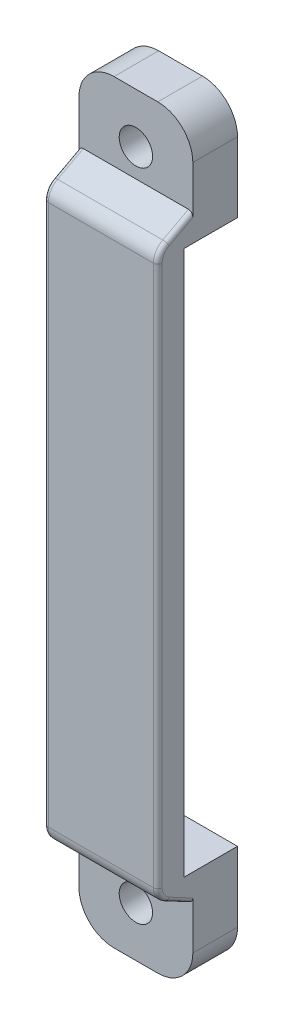
ISO-10303-21;
HEADER;
FILE_DESCRIPTION(('STEP AP214'),'2;1');
FILE_NAME('part.step','',(''),(''),'','','');
FILE_SCHEMA(('AUTOMOTIVE_DESIGN { 1 0 10303 214 1 1 1 1 }'));
ENDSEC;
DATA;
#1=APPLICATION_CONTEXT('core data for automotive mechanical design processes');
#2=APPLICATION_PROTOCOL_DEFINITION('international standard','automotive_design',2000,#1);
#3=PRODUCT_CONTEXT('',#1,'mechanical');
#4=PRODUCT('Part','Part','',(#3));
#5=PRODUCT_RELATED_PRODUCT_CATEGORY('part','',(#4));
#6=PRODUCT_DEFINITION_FORMATION('','',#4);
#7=PRODUCT_DEFINITION_CONTEXT('part definition',#1,'design');
#8=PRODUCT_DEFINITION('design','',#6,#7);
#9=PRODUCT_DEFINITION_SHAPE('','',#8);
#10=(LENGTH_UNIT() NAMED_UNIT(*) SI_UNIT(.MILLI.,.METRE.));
#11=(NAMED_UNIT(*) PLANE_ANGLE_UNIT() SI_UNIT($,.RADIAN.));
#12=(NAMED_UNIT(*) SI_UNIT($,.STERADIAN.) SOLID_ANGLE_UNIT());
#13=UNCERTAINTY_MEASURE_WITH_UNIT(LENGTH_MEASURE(1.E-05),#10,'distance_accuracy_value','');
#14=(GEOMETRIC_REPRESENTATION_CONTEXT(3) GLOBAL_UNCERTAINTY_ASSIGNED_CONTEXT((#13)) GLOBAL_UNIT_ASSIGNED_CONTEXT((#10,
#11,#12)) REPRESENTATION_CONTEXT('',''));
#15=CARTESIAN_POINT('',(0.,0.,0.));
#16=DIRECTION('',(0.,0.,1.));
#17=DIRECTION('',(1.,0.,0.));
#18=AXIS2_PLACEMENT_3D('',#15,#16,#17);
#19=CARTESIAN_POINT('',(-5.69720062871215,0.,3.));
#20=DIRECTION('',(1.,0.,0.));
#21=DIRECTION('',(0.,1.,0.));
#22=AXIS2_PLACEMENT_3D('',#19,#20,#21);
#23=PLANE('',#22);
#24=CARTESIAN_POINT('',(-5.69720062871216,56.2893408128409,1.));
#25=DIRECTION('',(1.,0.,0.));
#26=DIRECTION('',(0.,1.,0.));
#27=AXIS2_PLACEMENT_3D('',#24,#25,#26);
#28=CIRCLE('',#27,1.5);
#29=CARTESIAN_POINT('',(-5.69720062871216,57.6137622021293,1.70420734417884));
#30=VERTEX_POINT('',#29);
#31=CARTESIAN_POINT('',(-5.69720062871216,56.2893408128409,2.5));
#32=VERTEX_POINT('',#31);
#33=EDGE_CURVE('E361',#30,#32,#28,.T.);
#34=ORIENTED_EDGE('',*,*,#33,.F.);
#35=DIRECTION('',(0.,0.469471562785896,-0.882947592858924));
#36=VECTOR('',#35,1.);
#37=CARTESIAN_POINT('',(-5.69720062871216,44.378354184947,26.5963894817503));
#38=LINE('',#37,#36);
#39=CARTESIAN_POINT('',(-5.69720062871216,59.0516147521974,-1.));
#40=VERTEX_POINT('',#39);
#41=EDGE_CURVE('E323',#30,#40,#38,.T.);
#42=ORIENTED_EDGE('',*,*,#41,.T.);
#43=DIRECTION('',(0.,-1.,0.));
#44=VECTOR('',#43,1.);
#45=CARTESIAN_POINT('',(-5.69720062871215,0.,-1.));
#46=LINE('',#45,#44);
#47=CARTESIAN_POINT('',(-5.69720062871216,64.4910620508948,-1.));
#48=VERTEX_POINT('',#47);
#49=EDGE_CURVE('E463',#48,#40,#46,.T.);
#50=ORIENTED_EDGE('',*,*,#49,.F.);
#51=DIRECTION('',(0.,0.,-1.));
#52=VECTOR('',#51,1.);
#53=CARTESIAN_POINT('',(-5.69720062871216,64.4910620508948,-6.1));
#54=LINE('',#53,#52);
#55=CARTESIAN_POINT('',(-5.69720062871216,64.4910620508948,-6.1));
#56=VERTEX_POINT('',#55);
#57=EDGE_CURVE('E235',#48,#56,#54,.T.);
#58=ORIENTED_EDGE('',*,*,#57,.T.);
#59=DIRECTION('',(0.,1.,0.));
#60=VECTOR('',#59,1.);
#61=CARTESIAN_POINT('',(-5.69720062871215,0.,-6.1));
#62=LINE('',#61,#60);
#63=CARTESIAN_POINT('',(-5.69720062871216,56.4910620508953,-6.1));
#64=VERTEX_POINT('',#63);
#65=EDGE_CURVE('E216',#64,#56,#62,.T.);
#66=ORIENTED_EDGE('',*,*,#65,.F.);
#67=DIRECTION('',(0.,0.,1.));
#68=VECTOR('',#67,1.);
#69=CARTESIAN_POINT('',(-5.69720062871216,56.4910620508953,-6.1));
#70=LINE('',#69,#68);
#71=CARTESIAN_POINT('',(-5.69720062871216,56.4910620508953,0.));
#72=VERTEX_POINT('',#71);
#73=EDGE_CURVE('E225',#64,#72,#70,.T.);
#74=ORIENTED_EDGE('',*,*,#73,.T.);
#75=DIRECTION('',(0.,-1.,0.));
#76=VECTOR('',#75,1.);
#77=CARTESIAN_POINT('',(-5.69720062871215,0.,0.));
#78=LINE('',#77,#76);
#79=CARTESIAN_POINT('',(-5.69720062871215,-5.65893794910528,0.));
#80=VERTEX_POINT('',#79);
#81=EDGE_CURVE('E267',#72,#80,#78,.T.);
#82=ORIENTED_EDGE('',*,*,#81,.T.);
#83=DIRECTION('',(0.,0.,1.));
#84=VECTOR('',#83,1.);
#85=CARTESIAN_POINT('',(-5.69720062871215,-5.65893794910528,-6.1));
#86=LINE('',#85,#84);
#87=CARTESIAN_POINT('',(-5.69720062871215,-5.65893794910528,-6.1));
#88=VERTEX_POINT('',#87);
#89=EDGE_CURVE('E259',#88,#80,#86,.T.);
#90=ORIENTED_EDGE('',*,*,#89,.F.);
#91=DIRECTION('',(0.,1.,0.));
#92=VECTOR('',#91,1.);
#93=CARTESIAN_POINT('',(-5.69720062871215,0.,-6.1));
#94=LINE('',#93,#92);
#95=CARTESIAN_POINT('',(-5.69720062871215,-13.6589379491052,-6.1));
#96=VERTEX_POINT('',#95);
#97=EDGE_CURVE('E254',#96,#88,#94,.T.);
#98=ORIENTED_EDGE('',*,*,#97,.F.);
#99=DIRECTION('',(0.,0.,-1.));
#100=VECTOR('',#99,1.);
#101=CARTESIAN_POINT('',(-5.69720062871215,-13.6589379491052,3.));
#102=LINE('',#101,#100);
#103=CARTESIAN_POINT('',(-5.69720062871215,-13.6589379491052,-1.));
#104=VERTEX_POINT('',#103);
#105=EDGE_CURVE('E296',#96,#104,#102,.F.);
#106=ORIENTED_EDGE('',*,*,#105,.T.);
#107=DIRECTION('',(0.,-1.,0.));
#108=VECTOR('',#107,1.);
#109=CARTESIAN_POINT('',(-5.69720062871215,0.,-1.));
#110=LINE('',#109,#108);
#111=CARTESIAN_POINT('',(-5.69720062871215,-8.21949065040744,-1.));
#112=VERTEX_POINT('',#111);
#113=EDGE_CURVE('E387',#112,#104,#110,.T.);
#114=ORIENTED_EDGE('',*,*,#113,.F.);
#115=DIRECTION('',(0.,-0.469471562785896,-0.882947592858924));
#116=VECTOR('',#115,1.);
#117=CARTESIAN_POINT('',(-5.69720062871215,-4.74981060101959,5.52551909516782));
#118=LINE('',#117,#116);
#119=CARTESIAN_POINT('',(-5.69720062871215,-6.78163810033929,1.70420734417884));
#120=VERTEX_POINT('',#119);
#121=EDGE_CURVE('E317',#112,#120,#118,.F.);
#122=ORIENTED_EDGE('',*,*,#121,.T.);
#123=CARTESIAN_POINT('',(-5.69720062871215,-5.45721671105091,1.));
#124=DIRECTION('',(1.,0.,0.));
#125=DIRECTION('',(0.,1.,0.));
#126=AXIS2_PLACEMENT_3D('',#123,#124,#125);
#127=CIRCLE('',#126,1.5);
#128=CARTESIAN_POINT('',(-5.69720062871215,-5.45721671105091,2.5));
#129=VERTEX_POINT('',#128);
#130=EDGE_CURVE('E358',#129,#120,#127,.T.);
#131=ORIENTED_EDGE('',*,*,#130,.F.);
#132=DIRECTION('',(0.,-1.,0.));
#133=VECTOR('',#132,1.);
#134=CARTESIAN_POINT('',(-5.69720062871216,57.491062050896,2.5));
#135=LINE('',#134,#133);
#136=EDGE_CURVE('E320',#129,#32,#135,.F.);
#137=ORIENTED_EDGE('',*,*,#136,.T.);
#138=EDGE_LOOP('',(#34,#42,#50,#58,#66,#74,#82,#90,#98,#106,#114,#122,#131,#137));
#139=FACE_BOUND('',#138,.T.);
#140=ADVANCED_FACE('F45',(#139),#23,.F.);
#141=CARTESIAN_POINT('',(7.30279937128784,0.,3.));
#142=DIRECTION('',(1.,0.,0.));
#143=DIRECTION('',(0.,1.,0.));
#144=AXIS2_PLACEMENT_3D('',#141,#142,#143);
#145=PLANE('',#144);
#146=CARTESIAN_POINT('',(7.30279937128783,56.2893408128409,1.));
#147=DIRECTION('',(1.,0.,0.));
#148=DIRECTION('',(0.,1.,0.));
#149=AXIS2_PLACEMENT_3D('',#146,#147,#148);
#150=CIRCLE('',#149,1.5);
#151=CARTESIAN_POINT('',(7.30279937128783,56.2893408128409,2.5));
#152=VERTEX_POINT('',#151);
#153=CARTESIAN_POINT('',(7.30279937128783,57.6137622021293,1.70420734417884));
#154=VERTEX_POINT('',#153);
#155=EDGE_CURVE('E356',#152,#154,#150,.F.);
#156=ORIENTED_EDGE('',*,*,#155,.F.);
#157=DIRECTION('',(0.,-1.,0.));
#158=VECTOR('',#157,1.);
#159=CARTESIAN_POINT('',(7.30279937128784,0.,2.5));
#160=LINE('',#159,#158);
#161=CARTESIAN_POINT('',(7.30279937128784,-5.45721671105091,2.5));
#162=VERTEX_POINT('',#161);
#163=EDGE_CURVE('E325',#152,#162,#160,.T.);
#164=ORIENTED_EDGE('',*,*,#163,.T.);
#165=CARTESIAN_POINT('',(7.30279937128784,-5.45721671105091,1.));
#166=DIRECTION('',(1.,0.,0.));
#167=DIRECTION('',(0.,1.,0.));
#168=AXIS2_PLACEMENT_3D('',#165,#166,#167);
#169=CIRCLE('',#168,1.5);
#170=CARTESIAN_POINT('',(7.30279937128784,-6.78163810033929,1.70420734417884));
#171=VERTEX_POINT('',#170);
#172=EDGE_CURVE('E354',#171,#162,#169,.F.);
#173=ORIENTED_EDGE('',*,*,#172,.F.);
#174=DIRECTION('',(0.,0.469471562785896,0.882947592858924));
#175=VECTOR('',#174,1.);
#176=CARTESIAN_POINT('',(7.30279937128784,-8.3443018793225,-1.23473578139295));
#177=LINE('',#176,#175);
#178=CARTESIAN_POINT('',(7.30279937128784,-8.21949065040744,-1.));
#179=VERTEX_POINT('',#178);
#180=EDGE_CURVE('E331',#171,#179,#177,.F.);
#181=ORIENTED_EDGE('',*,*,#180,.T.);
#182=DIRECTION('',(0.,1.,0.));
#183=VECTOR('',#182,1.);
#184=CARTESIAN_POINT('',(7.30279937128784,0.,-1.));
#185=LINE('',#184,#183);
#186=CARTESIAN_POINT('',(7.30279937128784,-13.6589379491052,-1.));
#187=VERTEX_POINT('',#186);
#188=EDGE_CURVE('E541',#187,#179,#185,.T.);
#189=ORIENTED_EDGE('',*,*,#188,.F.);
#190=DIRECTION('',(0.,0.,-1.));
#191=VECTOR('',#190,1.);
#192=CARTESIAN_POINT('',(7.30279937128784,-13.6589379491052,-6.1));
#193=LINE('',#192,#191);
#194=CARTESIAN_POINT('',(7.30279937128784,-13.6589379491052,-6.1));
#195=VERTEX_POINT('',#194);
#196=EDGE_CURVE('E279',#187,#195,#193,.T.);
#197=ORIENTED_EDGE('',*,*,#196,.T.);
#198=DIRECTION('',(0.,-1.,0.));
#199=VECTOR('',#198,1.);
#200=CARTESIAN_POINT('',(7.30279937128784,0.,-6.1));
#201=LINE('',#200,#199);
#202=CARTESIAN_POINT('',(7.30279937128784,-5.65893794910528,-6.1));
#203=VERTEX_POINT('',#202);
#204=EDGE_CURVE('E247',#203,#195,#201,.T.);
#205=ORIENTED_EDGE('',*,*,#204,.F.);
#206=DIRECTION('',(0.,0.,1.));
#207=VECTOR('',#206,1.);
#208=CARTESIAN_POINT('',(7.30279937128784,-5.65893794910528,-6.1));
#209=LINE('',#208,#207);
#210=CARTESIAN_POINT('',(7.30279937128784,-5.65893794910528,0.));
#211=VERTEX_POINT('',#210);
#212=EDGE_CURVE('E264',#203,#211,#209,.T.);
#213=ORIENTED_EDGE('',*,*,#212,.T.);
#214=DIRECTION('',(0.,-1.,0.));
#215=VECTOR('',#214,1.);
#216=CARTESIAN_POINT('',(7.30279937128784,0.,0.));
#217=LINE('',#216,#215);
#218=CARTESIAN_POINT('',(7.30279937128783,56.4910620508953,0.));
#219=VERTEX_POINT('',#218);
#220=EDGE_CURVE('E269',#219,#211,#217,.T.);
#221=ORIENTED_EDGE('',*,*,#220,.F.);
#222=DIRECTION('',(0.,0.,1.));
#223=VECTOR('',#222,1.);
#224=CARTESIAN_POINT('',(7.30279937128783,56.4910620508953,-6.1));
#225=LINE('',#224,#223);
#226=CARTESIAN_POINT('',(7.30279937128783,56.4910620508953,-6.1));
#227=VERTEX_POINT('',#226);
#228=EDGE_CURVE('E230',#227,#219,#225,.T.);
#229=ORIENTED_EDGE('',*,*,#228,.F.);
#230=DIRECTION('',(0.,-1.,0.));
#231=VECTOR('',#230,1.);
#232=CARTESIAN_POINT('',(7.30279937128784,0.,-6.1));
#233=LINE('',#232,#231);
#234=CARTESIAN_POINT('',(7.30279937128783,64.4910620508948,-6.1));
#235=VERTEX_POINT('',#234);
#236=EDGE_CURVE('E218',#235,#227,#233,.T.);
#237=ORIENTED_EDGE('',*,*,#236,.F.);
#238=DIRECTION('',(0.,0.,-1.));
#239=VECTOR('',#238,1.);
#240=CARTESIAN_POINT('',(7.30279937128783,64.4910620508948,3.));
#241=LINE('',#240,#239);
#242=CARTESIAN_POINT('',(7.30279937128783,64.4910620508948,-1.));
#243=VERTEX_POINT('',#242);
#244=EDGE_CURVE('E277',#235,#243,#241,.F.);
#245=ORIENTED_EDGE('',*,*,#244,.T.);
#246=DIRECTION('',(0.,1.,0.));
#247=VECTOR('',#246,1.);
#248=CARTESIAN_POINT('',(7.30279937128784,0.,-1.));
#249=LINE('',#248,#247);
#250=CARTESIAN_POINT('',(7.30279937128783,59.0516147521974,-1.));
#251=VERTEX_POINT('',#250);
#252=EDGE_CURVE('E538',#251,#243,#249,.T.);
#253=ORIENTED_EDGE('',*,*,#252,.F.);
#254=DIRECTION('',(0.,-0.469471562785896,0.882947592858924));
#255=VECTOR('',#254,1.);
#256=CARTESIAN_POINT('',(7.30279937128783,57.0495882544665,2.76526421860705));
#257=LINE('',#256,#255);
#258=EDGE_CURVE('E328',#251,#154,#257,.T.);
#259=ORIENTED_EDGE('',*,*,#258,.T.);
#260=EDGE_LOOP('',(#156,#164,#173,#181,#189,#197,#205,#213,#221,#229,#237,#245,#253,#259));
#261=FACE_BOUND('',#260,.T.);
#262=ADVANCED_FACE('F432',(#261),#145,.T.);
#263=CARTESIAN_POINT('',(0.,0.,3.));
#264=DIRECTION('',(0.,0.,1.));
#265=DIRECTION('',(1.,0.,0.));
#266=AXIS2_PLACEMENT_3D('',#263,#264,#265);
#267=PLANE('',#266);
#268=DIRECTION('',(0.,-1.,0.));
#269=VECTOR('',#268,1.);
#270=CARTESIAN_POINT('',(-5.19720062871215,-6.65893794910603,3.));
#271=LINE('',#270,#269);
#272=CARTESIAN_POINT('',(-5.19720062871216,56.2893408128409,3.));
#273=VERTEX_POINT('',#272);
#274=CARTESIAN_POINT('',(-5.19720062871215,-5.45721671105091,3.));
#275=VERTEX_POINT('',#274);
#276=EDGE_CURVE('E314',#273,#275,#271,.T.);
#277=ORIENTED_EDGE('',*,*,#276,.T.);
#278=DIRECTION('',(-1.,0.,0.));
#279=VECTOR('',#278,1.);
#280=CARTESIAN_POINT('',(6.80279937128784,-5.45721671105091,3.));
#281=LINE('',#280,#279);
#282=CARTESIAN_POINT('',(6.80279937128784,-5.45721671105091,3.));
#283=VERTEX_POINT('',#282);
#284=EDGE_CURVE('E379',#275,#283,#281,.F.);
#285=ORIENTED_EDGE('',*,*,#284,.T.);
#286=DIRECTION('',(0.,-1.,0.));
#287=VECTOR('',#286,1.);
#288=CARTESIAN_POINT('',(6.80279937128784,0.,3.));
#289=LINE('',#288,#287);
#290=CARTESIAN_POINT('',(6.80279937128783,56.2893408128409,3.));
#291=VERTEX_POINT('',#290);
#292=EDGE_CURVE('E311',#283,#291,#289,.F.);
#293=ORIENTED_EDGE('',*,*,#292,.T.);
#294=DIRECTION('',(1.,0.,0.));
#295=VECTOR('',#294,1.);
#296=CARTESIAN_POINT('',(-5.19720062871216,56.2893408128409,3.));
#297=LINE('',#296,#295);
#298=EDGE_CURVE('E377',#291,#273,#297,.F.);
#299=ORIENTED_EDGE('',*,*,#298,.T.);
#300=EDGE_LOOP('',(#277,#285,#293,#299));
#301=FACE_BOUND('',#300,.T.);
#302=ADVANCED_FACE('F451',(#301),#267,.T.);
#303=CARTESIAN_POINT('',(0.,-17.6589379491052,3.));
#304=DIRECTION('',(0.,1.,0.));
#305=DIRECTION('',(0.,0.,1.));
#306=AXIS2_PLACEMENT_3D('',#303,#304,#305);
#307=PLANE('',#306);
#308=DIRECTION('',(-1.,0.,0.));
#309=VECTOR('',#308,1.);
#310=CARTESIAN_POINT('',(0.,-17.6589379491052,-6.1));
#311=LINE('',#310,#309);
#312=CARTESIAN_POINT('',(3.30279937128784,-17.6589379491052,-6.1));
#313=VERTEX_POINT('',#312);
#314=CARTESIAN_POINT('',(-1.69720062871215,-17.6589379491052,-6.1));
#315=VERTEX_POINT('',#314);
#316=EDGE_CURVE('E251',#313,#315,#311,.T.);
#317=ORIENTED_EDGE('',*,*,#316,.F.);
#318=DIRECTION('',(0.,0.,-1.));
#319=VECTOR('',#318,1.);
#320=CARTESIAN_POINT('',(3.30279937128784,-17.6589379491052,-1.));
#321=LINE('',#320,#319);
#322=CARTESIAN_POINT('',(3.30279937128784,-17.6589379491052,-1.));
#323=VERTEX_POINT('',#322);
#324=EDGE_CURVE('E289',#313,#323,#321,.F.);
#325=ORIENTED_EDGE('',*,*,#324,.T.);
#326=DIRECTION('',(1.,0.,0.));
#327=VECTOR('',#326,1.);
#328=CARTESIAN_POINT('',(0.,-17.6589379491052,-1.));
#329=LINE('',#328,#327);
#330=CARTESIAN_POINT('',(-1.69720062871215,-17.6589379491052,-1.));
#331=VERTEX_POINT('',#330);
#332=EDGE_CURVE('E413',#331,#323,#329,.T.);
#333=ORIENTED_EDGE('',*,*,#332,.F.);
#334=DIRECTION('',(0.,0.,-1.));
#335=VECTOR('',#334,1.);
#336=CARTESIAN_POINT('',(-1.69720062871215,-17.6589379491052,3.));
#337=LINE('',#336,#335);
#338=EDGE_CURVE('E286',#331,#315,#337,.T.);
#339=ORIENTED_EDGE('',*,*,#338,.T.);
#340=EDGE_LOOP('',(#317,#325,#333,#339));
#341=FACE_BOUND('',#340,.T.);
#342=ADVANCED_FACE('F486',(#341),#307,.F.);
#343=CARTESIAN_POINT('',(0.,68.4910620508948,3.));
#344=DIRECTION('',(0.,1.,0.));
#345=DIRECTION('',(0.,0.,1.));
#346=AXIS2_PLACEMENT_3D('',#343,#344,#345);
#347=PLANE('',#346);
#348=DIRECTION('',(-1.,0.,0.));
#349=VECTOR('',#348,1.);
#350=CARTESIAN_POINT('',(0.,68.4910620508948,-1.));
#351=LINE('',#350,#349);
#352=CARTESIAN_POINT('',(3.30279937128783,68.4910620508948,-1.));
#353=VERTEX_POINT('',#352);
#354=CARTESIAN_POINT('',(-1.69720062871216,68.4910620508948,-1.));
#355=VERTEX_POINT('',#354);
#356=EDGE_CURVE('E545',#353,#355,#351,.T.);
#357=ORIENTED_EDGE('',*,*,#356,.F.);
#358=DIRECTION('',(0.,0.,-1.));
#359=VECTOR('',#358,1.);
#360=CARTESIAN_POINT('',(3.30279937128783,68.4910620508948,3.));
#361=LINE('',#360,#359);
#362=CARTESIAN_POINT('',(3.30279937128783,68.4910620508948,-6.1));
#363=VERTEX_POINT('',#362);
#364=EDGE_CURVE('E300',#353,#363,#361,.T.);
#365=ORIENTED_EDGE('',*,*,#364,.T.);
#366=DIRECTION('',(1.,0.,0.));
#367=VECTOR('',#366,1.);
#368=CARTESIAN_POINT('',(0.,68.4910620508948,-6.1));
#369=LINE('',#368,#367);
#370=CARTESIAN_POINT('',(-1.69720062871216,68.4910620508948,-6.1));
#371=VERTEX_POINT('',#370);
#372=EDGE_CURVE('E229',#371,#363,#369,.T.);
#373=ORIENTED_EDGE('',*,*,#372,.F.);
#374=DIRECTION('',(0.,0.,-1.));
#375=VECTOR('',#374,1.);
#376=CARTESIAN_POINT('',(-1.69720062871216,68.4910620508948,-1.));
#377=LINE('',#376,#375);
#378=EDGE_CURVE('E298',#371,#355,#377,.F.);
#379=ORIENTED_EDGE('',*,*,#378,.T.);
#380=EDGE_LOOP('',(#357,#365,#373,#379));
#381=FACE_BOUND('',#380,.T.);
#382=ADVANCED_FACE('F493',(#381),#347,.T.);
#383=CARTESIAN_POINT('',(0.802799371287855,-11.9714379491052,-6.1));
#384=DIRECTION('',(0.,0.,1.));
#385=DIRECTION('',(1.,0.,0.));
#386=AXIS2_PLACEMENT_3D('',#383,#384,#385);
#387=CYLINDRICAL_SURFACE('',#386,1.905);
#388=CARTESIAN_POINT('',(0.802799371287855,-11.9714379491052,-6.1));
#389=DIRECTION('',(0.,0.,-1.));
#390=DIRECTION('',(-1.,0.,0.));
#391=AXIS2_PLACEMENT_3D('',#388,#389,#390);
#392=CIRCLE('',#391,1.905);
#393=CARTESIAN_POINT('',(-1.10220062871215,-11.9714379491052,-6.1));
#394=VERTEX_POINT('',#393);
#395=EDGE_CURVE('E256',#394,#394,#392,.F.);
#396=ORIENTED_EDGE('',*,*,#395,.F.);
#397=EDGE_LOOP('',(#396));
#398=FACE_BOUND('',#397,.T.);
#399=CARTESIAN_POINT('',(0.802799371287855,-11.9714379491052,-1.));
#400=DIRECTION('',(0.,0.,1.));
#401=DIRECTION('',(1.,0.,0.));
#402=AXIS2_PLACEMENT_3D('',#399,#400,#401);
#403=CIRCLE('',#402,1.905);
#404=CARTESIAN_POINT('',(2.70779937128785,-11.9714379491052,-1.));
#405=VERTEX_POINT('',#404);
#406=EDGE_CURVE('E536',#405,#405,#403,.F.);
#407=ORIENTED_EDGE('',*,*,#406,.F.);
#408=EDGE_LOOP('',(#407));
#409=FACE_BOUND('',#408,.T.);
#410=ADVANCED_FACE('F498',(#398,#409),#387,.F.);
#411=CARTESIAN_POINT('',(0.802799371287855,62.8035620508951,-6.1));
#412=DIRECTION('',(0.,0.,1.));
#413=DIRECTION('',(1.,0.,0.));
#414=AXIS2_PLACEMENT_3D('',#411,#412,#413);
#415=CYLINDRICAL_SURFACE('',#414,1.90500000000001);
#416=CARTESIAN_POINT('',(0.802799371287855,62.8035620508951,-6.1));
#417=DIRECTION('',(0.,0.,-1.));
#418=DIRECTION('',(-1.,0.,0.));
#419=AXIS2_PLACEMENT_3D('',#416,#417,#418);
#420=CIRCLE('',#419,1.90500000000001);
#421=CARTESIAN_POINT('',(-1.10220062871215,62.8035620508951,-6.1));
#422=VERTEX_POINT('',#421);
#423=EDGE_CURVE('E241',#422,#422,#420,.T.);
#424=ORIENTED_EDGE('',*,*,#423,.T.);
#425=EDGE_LOOP('',(#424));
#426=FACE_BOUND('',#425,.T.);
#427=CARTESIAN_POINT('',(0.802799371287855,62.8035620508951,-1.));
#428=DIRECTION('',(0.,0.,1.));
#429=DIRECTION('',(1.,0.,0.));
#430=AXIS2_PLACEMENT_3D('',#427,#428,#429);
#431=CIRCLE('',#430,1.90500000000001);
#432=CARTESIAN_POINT('',(2.70779937128786,62.8035620508951,-1.));
#433=VERTEX_POINT('',#432);
#434=EDGE_CURVE('E534',#433,#433,#431,.F.);
#435=ORIENTED_EDGE('',*,*,#434,.F.);
#436=EDGE_LOOP('',(#435));
#437=FACE_BOUND('',#436,.T.);
#438=ADVANCED_FACE('F504',(#426,#437),#415,.F.);
#439=CARTESIAN_POINT('',(0.,0.,0.));
#440=DIRECTION('',(0.,0.,1.));
#441=DIRECTION('',(1.,0.,0.));
#442=AXIS2_PLACEMENT_3D('',#439,#440,#441);
#443=PLANE('',#442);
#444=DIRECTION('',(-1.,0.,0.));
#445=VECTOR('',#444,1.);
#446=CARTESIAN_POINT('',(0.,56.4910620508953,0.));
#447=LINE('',#446,#445);
#448=EDGE_CURVE('E227',#219,#72,#447,.T.);
#449=ORIENTED_EDGE('',*,*,#448,.F.);
#450=ORIENTED_EDGE('',*,*,#220,.T.);
#451=DIRECTION('',(-1.,0.,0.));
#452=VECTOR('',#451,1.);
#453=CARTESIAN_POINT('',(0.,-5.65893794910528,0.));
#454=LINE('',#453,#452);
#455=EDGE_CURVE('E248',#211,#80,#454,.T.);
#456=ORIENTED_EDGE('',*,*,#455,.T.);
#457=ORIENTED_EDGE('',*,*,#81,.F.);
#458=EDGE_LOOP('',(#449,#450,#456,#457));
#459=FACE_BOUND('',#458,.T.);
#460=ADVANCED_FACE('F500',(#459),#443,.F.);
#461=CARTESIAN_POINT('',(0.,-5.65893794910528,-6.1));
#462=DIRECTION('',(0.,1.,0.));
#463=DIRECTION('',(0.,0.,1.));
#464=AXIS2_PLACEMENT_3D('',#461,#462,#463);
#465=PLANE('',#464);
#466=ORIENTED_EDGE('',*,*,#455,.F.);
#467=ORIENTED_EDGE('',*,*,#212,.F.);
#468=DIRECTION('',(-1.,0.,0.));
#469=VECTOR('',#468,1.);
#470=CARTESIAN_POINT('',(0.,-5.65893794910528,-6.1));
#471=LINE('',#470,#469);
#472=EDGE_CURVE('E244',#203,#88,#471,.T.);
#473=ORIENTED_EDGE('',*,*,#472,.T.);
#474=ORIENTED_EDGE('',*,*,#89,.T.);
#475=EDGE_LOOP('',(#466,#467,#473,#474));
#476=FACE_BOUND('',#475,.T.);
#477=ADVANCED_FACE('F503',(#476),#465,.T.);
#478=CARTESIAN_POINT('',(0.,0.,-6.1));
#479=DIRECTION('',(0.,0.,-1.));
#480=DIRECTION('',(-1.,0.,0.));
#481=AXIS2_PLACEMENT_3D('',#478,#479,#480);
#482=PLANE('',#481);
#483=ORIENTED_EDGE('',*,*,#204,.T.);
#484=CARTESIAN_POINT('',(3.30279937128784,-13.6589379491052,-6.1));
#485=DIRECTION('',(0.,0.,-1.));
#486=DIRECTION('',(-1.,0.,0.));
#487=AXIS2_PLACEMENT_3D('',#484,#485,#486);
#488=CIRCLE('',#487,4.);
#489=EDGE_CURVE('E284',#195,#313,#488,.T.);
#490=ORIENTED_EDGE('',*,*,#489,.T.);
#491=ORIENTED_EDGE('',*,*,#316,.T.);
#492=CARTESIAN_POINT('',(-1.69720062871215,-13.6589379491052,-6.1));
#493=DIRECTION('',(0.,0.,-1.));
#494=DIRECTION('',(-1.,0.,0.));
#495=AXIS2_PLACEMENT_3D('',#492,#493,#494);
#496=CIRCLE('',#495,4.);
#497=EDGE_CURVE('E282',#315,#96,#496,.T.);
#498=ORIENTED_EDGE('',*,*,#497,.T.);
#499=ORIENTED_EDGE('',*,*,#97,.T.);
#500=ORIENTED_EDGE('',*,*,#472,.F.);
#501=EDGE_LOOP('',(#483,#490,#491,#498,#499,#500));
#502=FACE_BOUND('',#501,.T.);
#503=ORIENTED_EDGE('',*,*,#395,.T.);
#504=EDGE_LOOP('',(#503));
#505=FACE_BOUND('',#504,.T.);
#506=ADVANCED_FACE('F510',(#502,#505),#482,.T.);
#507=CARTESIAN_POINT('',(0.,56.4910620508953,-6.1));
#508=DIRECTION('',(0.,1.,0.));
#509=DIRECTION('',(0.,0.,1.));
#510=AXIS2_PLACEMENT_3D('',#507,#508,#509);
#511=PLANE('',#510);
#512=ORIENTED_EDGE('',*,*,#448,.T.);
#513=ORIENTED_EDGE('',*,*,#73,.F.);
#514=DIRECTION('',(-1.,0.,0.));
#515=VECTOR('',#514,1.);
#516=CARTESIAN_POINT('',(0.,56.4910620508953,-6.1));
#517=LINE('',#516,#515);
#518=EDGE_CURVE('E211',#227,#64,#517,.T.);
#519=ORIENTED_EDGE('',*,*,#518,.F.);
#520=ORIENTED_EDGE('',*,*,#228,.T.);
#521=EDGE_LOOP('',(#512,#513,#519,#520));
#522=FACE_BOUND('',#521,.T.);
#523=ADVANCED_FACE('F226',(#522),#511,.F.);
#524=CARTESIAN_POINT('',(0.,0.,-6.1));
#525=DIRECTION('',(0.,0.,-1.));
#526=DIRECTION('',(-1.,0.,0.));
#527=AXIS2_PLACEMENT_3D('',#524,#525,#526);
#528=PLANE('',#527);
#529=ORIENTED_EDGE('',*,*,#423,.F.);
#530=EDGE_LOOP('',(#529));
#531=FACE_BOUND('',#530,.T.);
#532=ORIENTED_EDGE('',*,*,#372,.T.);
#533=CARTESIAN_POINT('',(3.30279937128783,64.4910620508948,-6.1));
#534=DIRECTION('',(0.,0.,-1.));
#535=DIRECTION('',(-1.,0.,0.));
#536=AXIS2_PLACEMENT_3D('',#533,#534,#535);
#537=CIRCLE('',#536,4.);
#538=EDGE_CURVE('E305',#363,#235,#537,.T.);
#539=ORIENTED_EDGE('',*,*,#538,.T.);
#540=ORIENTED_EDGE('',*,*,#236,.T.);
#541=ORIENTED_EDGE('',*,*,#518,.T.);
#542=ORIENTED_EDGE('',*,*,#65,.T.);
#543=CARTESIAN_POINT('',(-1.69720062871216,64.4910620508948,-6.1));
#544=DIRECTION('',(0.,0.,-1.));
#545=DIRECTION('',(-1.,0.,0.));
#546=AXIS2_PLACEMENT_3D('',#543,#544,#545);
#547=CIRCLE('',#546,4.);
#548=EDGE_CURVE('E303',#56,#371,#547,.T.);
#549=ORIENTED_EDGE('',*,*,#548,.T.);
#550=EDGE_LOOP('',(#532,#539,#540,#541,#542,#549));
#551=FACE_BOUND('',#550,.T.);
#552=ADVANCED_FACE('F214',(#531,#551),#528,.T.);
#553=CARTESIAN_POINT('',(0.,0.,-1.));
#554=DIRECTION('',(0.,0.,1.));
#555=DIRECTION('',(1.,0.,0.));
#556=AXIS2_PLACEMENT_3D('',#553,#554,#555);
#557=PLANE('',#556);
#558=ORIENTED_EDGE('',*,*,#434,.T.);
#559=EDGE_LOOP('',(#558));
#560=FACE_BOUND('',#559,.T.);
#561=ORIENTED_EDGE('',*,*,#252,.T.);
#562=CARTESIAN_POINT('',(3.30279937128783,64.4910620508948,-1.));
#563=DIRECTION('',(0.,0.,1.));
#564=DIRECTION('',(1.,0.,0.));
#565=AXIS2_PLACEMENT_3D('',#562,#563,#564);
#566=CIRCLE('',#565,4.);
#567=EDGE_CURVE('E309',#243,#353,#566,.T.);
#568=ORIENTED_EDGE('',*,*,#567,.T.);
#569=ORIENTED_EDGE('',*,*,#356,.T.);
#570=CARTESIAN_POINT('',(-1.69720062871216,64.4910620508948,-1.));
#571=DIRECTION('',(0.,0.,1.));
#572=DIRECTION('',(1.,0.,0.));
#573=AXIS2_PLACEMENT_3D('',#570,#571,#572);
#574=CIRCLE('',#573,4.);
#575=EDGE_CURVE('E307',#355,#48,#574,.T.);
#576=ORIENTED_EDGE('',*,*,#575,.T.);
#577=ORIENTED_EDGE('',*,*,#49,.T.);
#578=CARTESIAN_POINT('',(-5.19720062871216,59.0516147521974,-1.));
#579=DIRECTION('',(0.,0.,1.));
#580=DIRECTION('',(0.,1.,0.));
#581=AXIS2_PLACEMENT_3D('',#578,#579,#580);
#582=ELLIPSE('',#581,0.566285025344521,0.5);
#583=CARTESIAN_POINT('',(-5.19720062871216,59.6178997775419,-1.));
#584=VERTEX_POINT('',#583);
#585=EDGE_CURVE('E343',#40,#584,#582,.F.);
#586=ORIENTED_EDGE('',*,*,#585,.T.);
#587=DIRECTION('',(1.,0.,0.));
#588=VECTOR('',#587,1.);
#589=CARTESIAN_POINT('',(0.,59.6178997775419,-1.));
#590=LINE('',#589,#588);
#591=CARTESIAN_POINT('',(6.80279937128783,59.6178997775419,-1.));
#592=VERTEX_POINT('',#591);
#593=EDGE_CURVE('E274',#584,#592,#590,.T.);
#594=ORIENTED_EDGE('',*,*,#593,.T.);
#595=CARTESIAN_POINT('',(6.80279937128783,59.0516147521974,-1.));
#596=DIRECTION('',(0.,0.,1.));
#597=DIRECTION('',(0.,1.,0.));
#598=AXIS2_PLACEMENT_3D('',#595,#596,#597);
#599=ELLIPSE('',#598,0.566285025344521,0.5);
#600=EDGE_CURVE('E345',#592,#251,#599,.F.);
#601=ORIENTED_EDGE('',*,*,#600,.T.);
#602=EDGE_LOOP('',(#561,#568,#569,#576,#577,#586,#594,#601));
#603=FACE_BOUND('',#602,.T.);
#604=ADVANCED_FACE('F462',(#560,#603),#557,.T.);
#605=CARTESIAN_POINT('',(0.,0.,-1.));
#606=DIRECTION('',(0.,0.,1.));
#607=DIRECTION('',(1.,0.,0.));
#608=AXIS2_PLACEMENT_3D('',#605,#606,#607);
#609=PLANE('',#608);
#610=ORIENTED_EDGE('',*,*,#332,.T.);
#611=CARTESIAN_POINT('',(3.30279937128784,-13.6589379491052,-1.));
#612=DIRECTION('',(0.,0.,1.));
#613=DIRECTION('',(1.,0.,0.));
#614=AXIS2_PLACEMENT_3D('',#611,#612,#613);
#615=CIRCLE('',#614,4.);
#616=EDGE_CURVE('E293',#323,#187,#615,.T.);
#617=ORIENTED_EDGE('',*,*,#616,.T.);
#618=ORIENTED_EDGE('',*,*,#188,.T.);
#619=CARTESIAN_POINT('',(6.80279937128784,-8.21949065040744,-1.));
#620=DIRECTION('',(0.,0.,1.));
#621=DIRECTION('',(0.,-1.,0.));
#622=AXIS2_PLACEMENT_3D('',#619,#620,#621);
#623=ELLIPSE('',#622,0.566285025344521,0.5);
#624=CARTESIAN_POINT('',(6.80279937128784,-8.78577567575196,-1.));
#625=VERTEX_POINT('',#624);
#626=EDGE_CURVE('E341',#179,#625,#623,.F.);
#627=ORIENTED_EDGE('',*,*,#626,.T.);
#628=DIRECTION('',(-1.,0.,0.));
#629=VECTOR('',#628,1.);
#630=CARTESIAN_POINT('',(-5.69720062871215,-8.78577567575196,-1.));
#631=LINE('',#630,#629);
#632=CARTESIAN_POINT('',(-5.19720062871215,-8.78577567575196,-1.));
#633=VERTEX_POINT('',#632);
#634=EDGE_CURVE('E271',#625,#633,#631,.T.);
#635=ORIENTED_EDGE('',*,*,#634,.T.);
#636=CARTESIAN_POINT('',(-5.19720062871215,-8.21949065040744,-1.));
#637=DIRECTION('',(0.,0.,1.));
#638=DIRECTION('',(0.,-1.,0.));
#639=AXIS2_PLACEMENT_3D('',#636,#637,#638);
#640=ELLIPSE('',#639,0.566285025344521,0.5);
#641=EDGE_CURVE('E348',#633,#112,#640,.F.);
#642=ORIENTED_EDGE('',*,*,#641,.T.);
#643=ORIENTED_EDGE('',*,*,#113,.T.);
#644=CARTESIAN_POINT('',(-1.69720062871215,-13.6589379491052,-1.));
#645=DIRECTION('',(0.,0.,1.));
#646=DIRECTION('',(1.,0.,0.));
#647=AXIS2_PLACEMENT_3D('',#644,#645,#646);
#648=CIRCLE('',#647,4.);
#649=EDGE_CURVE('E291',#104,#331,#648,.T.);
#650=ORIENTED_EDGE('',*,*,#649,.T.);
#651=EDGE_LOOP('',(#610,#617,#618,#627,#635,#642,#643,#650));
#652=FACE_BOUND('',#651,.T.);
#653=ORIENTED_EDGE('',*,*,#406,.T.);
#654=EDGE_LOOP('',(#653));
#655=FACE_BOUND('',#654,.T.);
#656=ADVANCED_FACE('F416',(#652,#655),#609,.T.);
#657=CARTESIAN_POINT('',(0.,-6.65893794910603,2.99999999999998));
#658=DIRECTION('',(0.,-0.882947592858924,0.469471562785896));
#659=DIRECTION('',(-1.,0.,0.));
#660=AXIS2_PLACEMENT_3D('',#657,#658,#659);
#661=PLANE('',#660);
#662=DIRECTION('',(0.,-0.469471562785896,-0.882947592858924));
#663=VECTOR('',#662,1.);
#664=CARTESIAN_POINT('',(6.80279937128784,-6.65893794910602,2.99999999999999));
#665=LINE('',#664,#663);
#666=CARTESIAN_POINT('',(6.80279937128784,-7.22311189676876,1.93894312557179));
#667=VERTEX_POINT('',#666);
#668=EDGE_CURVE('E335',#625,#667,#665,.F.);
#669=ORIENTED_EDGE('',*,*,#668,.T.);
#670=DIRECTION('',(1.,0.,0.));
#671=VECTOR('',#670,1.);
#672=CARTESIAN_POINT('',(-5.19720062871215,-7.22311189676876,1.93894312557179));
#673=LINE('',#672,#671);
#674=CARTESIAN_POINT('',(-5.19720062871215,-7.22311189676876,1.93894312557179));
#675=VERTEX_POINT('',#674);
#676=EDGE_CURVE('E54',#667,#675,#673,.F.);
#677=ORIENTED_EDGE('',*,*,#676,.T.);
#678=DIRECTION('',(0.,0.469471562785896,0.882947592858924));
#679=VECTOR('',#678,1.);
#680=CARTESIAN_POINT('',(-5.19720062871215,-6.65893794910603,2.99999999999998));
#681=LINE('',#680,#679);
#682=EDGE_CURVE('E333',#675,#633,#681,.F.);
#683=ORIENTED_EDGE('',*,*,#682,.T.);
#684=ORIENTED_EDGE('',*,*,#634,.F.);
#685=EDGE_LOOP('',(#669,#677,#683,#684));
#686=FACE_BOUND('',#685,.T.);
#687=ADVANCED_FACE('F422',(#686),#661,.T.);
#688=CARTESIAN_POINT('',(0.,59.6178997775419,-1.));
#689=DIRECTION('',(0.,-0.882947592858924,-0.469471562785896));
#690=DIRECTION('',(1.,0.,0.));
#691=AXIS2_PLACEMENT_3D('',#688,#689,#690);
#692=PLANE('',#691);
#693=DIRECTION('',(0.,0.469471562785896,-0.882947592858924));
#694=VECTOR('',#693,1.);
#695=CARTESIAN_POINT('',(-5.19720062871216,59.6178997775419,-1.));
#696=LINE('',#695,#694);
#697=CARTESIAN_POINT('',(-5.19720062871216,58.0552359985587,1.93894312557179));
#698=VERTEX_POINT('',#697);
#699=EDGE_CURVE('E339',#584,#698,#696,.F.);
#700=ORIENTED_EDGE('',*,*,#699,.T.);
#701=DIRECTION('',(1.,0.,0.));
#702=VECTOR('',#701,1.);
#703=CARTESIAN_POINT('',(6.80279937128783,58.0552359985587,1.93894312557179));
#704=LINE('',#703,#702);
#705=CARTESIAN_POINT('',(6.80279937128783,58.0552359985587,1.93894312557179));
#706=VERTEX_POINT('',#705);
#707=EDGE_CURVE('E11',#698,#706,#704,.T.);
#708=ORIENTED_EDGE('',*,*,#707,.T.);
#709=DIRECTION('',(0.,-0.469471562785896,0.882947592858924));
#710=VECTOR('',#709,1.);
#711=CARTESIAN_POINT('',(6.80279937128783,59.6178997775419,-0.999999999999998));
#712=LINE('',#711,#710);
#713=EDGE_CURVE('E337',#706,#592,#712,.F.);
#714=ORIENTED_EDGE('',*,*,#713,.T.);
#715=ORIENTED_EDGE('',*,*,#593,.F.);
#716=EDGE_LOOP('',(#700,#708,#714,#715));
#717=FACE_BOUND('',#716,.T.);
#718=ADVANCED_FACE('F464',(#717),#692,.F.);
#719=CARTESIAN_POINT('',(3.30279937128784,-13.6589379491052,3.));
#720=DIRECTION('',(0.,0.,1.));
#721=DIRECTION('',(1.,0.,0.));
#722=AXIS2_PLACEMENT_3D('',#719,#720,#721);
#723=CYLINDRICAL_SURFACE('',#722,4.);
#724=ORIENTED_EDGE('',*,*,#616,.F.);
#725=ORIENTED_EDGE('',*,*,#324,.F.);
#726=ORIENTED_EDGE('',*,*,#489,.F.);
#727=ORIENTED_EDGE('',*,*,#196,.F.);
#728=EDGE_LOOP('',(#724,#725,#726,#727));
#729=FACE_BOUND('',#728,.T.);
#730=ADVANCED_FACE('F466',(#729),#723,.T.);
#731=CARTESIAN_POINT('',(-1.69720062871215,-13.6589379491052,3.));
#732=DIRECTION('',(0.,0.,-1.));
#733=DIRECTION('',(-1.,0.,0.));
#734=AXIS2_PLACEMENT_3D('',#731,#732,#733);
#735=CYLINDRICAL_SURFACE('',#734,4.);
#736=ORIENTED_EDGE('',*,*,#649,.F.);
#737=ORIENTED_EDGE('',*,*,#105,.F.);
#738=ORIENTED_EDGE('',*,*,#497,.F.);
#739=ORIENTED_EDGE('',*,*,#338,.F.);
#740=EDGE_LOOP('',(#736,#737,#738,#739));
#741=FACE_BOUND('',#740,.T.);
#742=ADVANCED_FACE('F473',(#741),#735,.T.);
#743=CARTESIAN_POINT('',(3.30279937128783,64.4910620508948,3.));
#744=DIRECTION('',(0.,0.,-1.));
#745=DIRECTION('',(-1.,0.,0.));
#746=AXIS2_PLACEMENT_3D('',#743,#744,#745);
#747=CYLINDRICAL_SURFACE('',#746,4.);
#748=ORIENTED_EDGE('',*,*,#567,.F.);
#749=ORIENTED_EDGE('',*,*,#244,.F.);
#750=ORIENTED_EDGE('',*,*,#538,.F.);
#751=ORIENTED_EDGE('',*,*,#364,.F.);
#752=EDGE_LOOP('',(#748,#749,#750,#751));
#753=FACE_BOUND('',#752,.T.);
#754=ADVANCED_FACE('F565',(#753),#747,.T.);
#755=CARTESIAN_POINT('',(-1.69720062871216,64.4910620508948,3.));
#756=DIRECTION('',(0.,0.,1.));
#757=DIRECTION('',(1.,0.,0.));
#758=AXIS2_PLACEMENT_3D('',#755,#756,#757);
#759=CYLINDRICAL_SURFACE('',#758,4.);
#760=ORIENTED_EDGE('',*,*,#575,.F.);
#761=ORIENTED_EDGE('',*,*,#378,.F.);
#762=ORIENTED_EDGE('',*,*,#548,.F.);
#763=ORIENTED_EDGE('',*,*,#57,.F.);
#764=EDGE_LOOP('',(#760,#761,#762,#763));
#765=FACE_BOUND('',#764,.T.);
#766=ADVANCED_FACE('F570',(#765),#759,.T.);
#767=CARTESIAN_POINT('',(-5.19720062871216,44.378354184947,26.5963894817503));
#768=DIRECTION('',(0.,0.469471562785896,-0.882947592858924));
#769=DIRECTION('',(0.,0.882947592858924,0.469471562785896));
#770=AXIS2_PLACEMENT_3D('',#767,#768,#769);
#771=CYLINDRICAL_SURFACE('',#770,0.5);
#772=ORIENTED_EDGE('',*,*,#41,.F.);
#773=CARTESIAN_POINT('',(-5.19720062871216,57.6137622021293,1.70420734417884));
#774=DIRECTION('',(0.,0.469471562785893,-0.882947592858926));
#775=DIRECTION('',(0.,0.882947592858926,0.469471562785893));
#776=AXIS2_PLACEMENT_3D('',#773,#774,#775);
#777=CIRCLE('',#776,0.5);
#778=EDGE_CURVE('E62',#30,#698,#777,.T.);
#779=ORIENTED_EDGE('',*,*,#778,.T.);
#780=ORIENTED_EDGE('',*,*,#699,.F.);
#781=ORIENTED_EDGE('',*,*,#585,.F.);
#782=EDGE_LOOP('',(#772,#779,#780,#781));
#783=FACE_BOUND('',#782,.T.);
#784=ADVANCED_FACE('F459',(#783),#771,.T.);
#785=CARTESIAN_POINT('',(-5.19720062871215,-4.74981060101959,5.52551909516782));
#786=DIRECTION('',(0.,-0.469471562785896,-0.882947592858924));
#787=DIRECTION('',(0.,0.882947592858924,-0.469471562785896));
#788=AXIS2_PLACEMENT_3D('',#785,#786,#787);
#789=CYLINDRICAL_SURFACE('',#788,0.5);
#790=ORIENTED_EDGE('',*,*,#682,.F.);
#791=CARTESIAN_POINT('',(-5.19720062871215,-6.78163810033929,1.70420734417884));
#792=DIRECTION('',(0.,-0.469471562785896,-0.882947592858924));
#793=DIRECTION('',(0.,0.882947592858924,-0.469471562785896));
#794=AXIS2_PLACEMENT_3D('',#791,#792,#793);
#795=CIRCLE('',#794,0.5);
#796=EDGE_CURVE('E373',#675,#120,#795,.T.);
#797=ORIENTED_EDGE('',*,*,#796,.T.);
#798=ORIENTED_EDGE('',*,*,#121,.F.);
#799=ORIENTED_EDGE('',*,*,#641,.F.);
#800=EDGE_LOOP('',(#790,#797,#798,#799));
#801=FACE_BOUND('',#800,.T.);
#802=ADVANCED_FACE('F405',(#801),#789,.T.);
#803=CARTESIAN_POINT('',(-5.19720062871215,0.,2.5));
#804=DIRECTION('',(0.,1.,0.));
#805=DIRECTION('',(-1.,0.,0.));
#806=AXIS2_PLACEMENT_3D('',#803,#804,#805);
#807=CYLINDRICAL_SURFACE('',#806,0.5);
#808=ORIENTED_EDGE('',*,*,#276,.F.);
#809=CARTESIAN_POINT('',(-5.19720062871216,56.2893408128409,2.5));
#810=DIRECTION('',(0.,-1.,0.));
#811=DIRECTION('',(0.,0.,-1.));
#812=AXIS2_PLACEMENT_3D('',#809,#810,#811);
#813=CIRCLE('',#812,0.5);
#814=EDGE_CURVE('E366',#273,#32,#813,.T.);
#815=ORIENTED_EDGE('',*,*,#814,.T.);
#816=ORIENTED_EDGE('',*,*,#136,.F.);
#817=CARTESIAN_POINT('',(-5.19720062871215,-5.45721671105091,2.5));
#818=DIRECTION('',(0.,1.,0.));
#819=DIRECTION('',(0.,0.,1.));
#820=AXIS2_PLACEMENT_3D('',#817,#818,#819);
#821=CIRCLE('',#820,0.5);
#822=EDGE_CURVE('E364',#129,#275,#821,.T.);
#823=ORIENTED_EDGE('',*,*,#822,.T.);
#824=EDGE_LOOP('',(#808,#815,#816,#823));
#825=FACE_BOUND('',#824,.T.);
#826=ADVANCED_FACE('F454',(#825),#807,.T.);
#827=CARTESIAN_POINT('',(6.80279937128784,44.378354184947,26.5963894817503));
#828=DIRECTION('',(0.,0.469471562785896,-0.882947592858924));
#829=DIRECTION('',(0.,0.882947592858924,0.469471562785896));
#830=AXIS2_PLACEMENT_3D('',#827,#828,#829);
#831=CYLINDRICAL_SURFACE('',#830,0.5);
#832=ORIENTED_EDGE('',*,*,#713,.F.);
#833=CARTESIAN_POINT('',(6.80279937128783,57.6137622021293,1.70420734417884));
#834=DIRECTION('',(0.,0.469471562785896,-0.882947592858924));
#835=DIRECTION('',(0.,0.882947592858924,0.469471562785896));
#836=AXIS2_PLACEMENT_3D('',#833,#834,#835);
#837=CIRCLE('',#836,0.5);
#838=EDGE_CURVE('E351',#706,#154,#837,.T.);
#839=ORIENTED_EDGE('',*,*,#838,.T.);
#840=ORIENTED_EDGE('',*,*,#258,.F.);
#841=ORIENTED_EDGE('',*,*,#600,.F.);
#842=EDGE_LOOP('',(#832,#839,#840,#841));
#843=FACE_BOUND('',#842,.T.);
#844=ADVANCED_FACE('F439',(#843),#831,.T.);
#845=CARTESIAN_POINT('',(6.80279937128784,0.,2.5));
#846=DIRECTION('',(0.,-1.,0.));
#847=DIRECTION('',(1.,0.,0.));
#848=AXIS2_PLACEMENT_3D('',#845,#846,#847);
#849=CYLINDRICAL_SURFACE('',#848,0.5);
#850=ORIENTED_EDGE('',*,*,#292,.F.);
#851=CARTESIAN_POINT('',(6.80279937128784,-5.45721671105091,2.5));
#852=DIRECTION('',(0.,1.,0.));
#853=DIRECTION('',(0.,0.,1.));
#854=AXIS2_PLACEMENT_3D('',#851,#852,#853);
#855=CIRCLE('',#854,0.5);
#856=EDGE_CURVE('E370',#283,#162,#855,.T.);
#857=ORIENTED_EDGE('',*,*,#856,.T.);
#858=ORIENTED_EDGE('',*,*,#163,.F.);
#859=CARTESIAN_POINT('',(6.80279937128783,56.2893408128409,2.5));
#860=DIRECTION('',(0.,-1.,0.));
#861=DIRECTION('',(0.,0.,-1.));
#862=AXIS2_PLACEMENT_3D('',#859,#860,#861);
#863=CIRCLE('',#862,0.5);
#864=EDGE_CURVE('E368',#152,#291,#863,.T.);
#865=ORIENTED_EDGE('',*,*,#864,.T.);
#866=EDGE_LOOP('',(#850,#857,#858,#865));
#867=FACE_BOUND('',#866,.T.);
#868=ADVANCED_FACE('F430',(#867),#849,.T.);
#869=CARTESIAN_POINT('',(6.80279937128784,-4.74981060101959,5.52551909516782));
#870=DIRECTION('',(0.,-0.469471562785896,-0.882947592858924));
#871=DIRECTION('',(0.,0.882947592858924,-0.469471562785896));
#872=AXIS2_PLACEMENT_3D('',#869,#870,#871);
#873=CYLINDRICAL_SURFACE('',#872,0.5);
#874=ORIENTED_EDGE('',*,*,#180,.F.);
#875=CARTESIAN_POINT('',(6.80279937128784,-6.78163810033929,1.70420734417884));
#876=DIRECTION('',(0.,-0.469471562785896,-0.882947592858924));
#877=DIRECTION('',(0.,0.882947592858924,-0.469471562785896));
#878=AXIS2_PLACEMENT_3D('',#875,#876,#877);
#879=CIRCLE('',#878,0.5);
#880=EDGE_CURVE('E70',#171,#667,#879,.T.);
#881=ORIENTED_EDGE('',*,*,#880,.T.);
#882=ORIENTED_EDGE('',*,*,#668,.F.);
#883=ORIENTED_EDGE('',*,*,#626,.F.);
#884=EDGE_LOOP('',(#874,#881,#882,#883));
#885=FACE_BOUND('',#884,.T.);
#886=ADVANCED_FACE('F423',(#885),#873,.T.);
#887=CARTESIAN_POINT('',(-5.19720062871216,56.2893408128409,1.));
#888=DIRECTION('',(1.,0.,0.));
#889=DIRECTION('',(0.,1.,0.));
#890=AXIS2_PLACEMENT_3D('',#887,#888,#889);
#891=TOROIDAL_SURFACE('',#890,1.5,0.5);
#892=ORIENTED_EDGE('',*,*,#33,.T.);
#893=ORIENTED_EDGE('',*,*,#814,.F.);
#894=CARTESIAN_POINT('',(-5.19720062871216,56.2893408128409,1.));
#895=DIRECTION('',(1.,0.,0.));
#896=DIRECTION('',(0.,1.,0.));
#897=AXIS2_PLACEMENT_3D('',#894,#895,#896);
#898=CIRCLE('',#897,2.);
#899=EDGE_CURVE('E385',#698,#273,#898,.T.);
#900=ORIENTED_EDGE('',*,*,#899,.F.);
#901=ORIENTED_EDGE('',*,*,#778,.F.);
#902=EDGE_LOOP('',(#892,#893,#900,#901));
#903=FACE_BOUND('',#902,.T.);
#904=ADVANCED_FACE('F456',(#903),#891,.T.);
#905=CARTESIAN_POINT('',(0.,56.2893408128409,1.));
#906=DIRECTION('',(-1.,0.,0.));
#907=DIRECTION('',(0.,0.,1.));
#908=AXIS2_PLACEMENT_3D('',#905,#906,#907);
#909=CYLINDRICAL_SURFACE('',#908,2.);
#910=ORIENTED_EDGE('',*,*,#899,.T.);
#911=ORIENTED_EDGE('',*,*,#298,.F.);
#912=CARTESIAN_POINT('',(6.80279937128783,56.2893408128409,1.));
#913=DIRECTION('',(1.,0.,0.));
#914=DIRECTION('',(0.,1.,0.));
#915=AXIS2_PLACEMENT_3D('',#912,#913,#914);
#916=CIRCLE('',#915,2.);
#917=EDGE_CURVE('E382',#706,#291,#916,.T.);
#918=ORIENTED_EDGE('',*,*,#917,.F.);
#919=ORIENTED_EDGE('',*,*,#707,.F.);
#920=EDGE_LOOP('',(#910,#911,#918,#919));
#921=FACE_BOUND('',#920,.T.);
#922=ADVANCED_FACE('F447',(#921),#909,.T.);
#923=CARTESIAN_POINT('',(6.80279937128783,56.2893408128409,1.));
#924=DIRECTION('',(1.,0.,0.));
#925=DIRECTION('',(0.,1.,0.));
#926=AXIS2_PLACEMENT_3D('',#923,#924,#925);
#927=TOROIDAL_SURFACE('',#926,1.5,0.5);
#928=ORIENTED_EDGE('',*,*,#838,.F.);
#929=ORIENTED_EDGE('',*,*,#917,.T.);
#930=ORIENTED_EDGE('',*,*,#864,.F.);
#931=ORIENTED_EDGE('',*,*,#155,.T.);
#932=EDGE_LOOP('',(#928,#929,#930,#931));
#933=FACE_BOUND('',#932,.T.);
#934=ADVANCED_FACE('F436',(#933),#927,.T.);
#935=CARTESIAN_POINT('',(-5.19720062871215,-5.45721671105091,1.));
#936=DIRECTION('',(1.,0.,0.));
#937=DIRECTION('',(0.,1.,0.));
#938=AXIS2_PLACEMENT_3D('',#935,#936,#937);
#939=TOROIDAL_SURFACE('',#938,1.5,0.5);
#940=ORIENTED_EDGE('',*,*,#130,.T.);
#941=ORIENTED_EDGE('',*,*,#796,.F.);
#942=CARTESIAN_POINT('',(-5.19720062871215,-5.45721671105091,1.));
#943=DIRECTION('',(1.,0.,0.));
#944=DIRECTION('',(0.,1.,0.));
#945=AXIS2_PLACEMENT_3D('',#942,#943,#944);
#946=CIRCLE('',#945,2.);
#947=EDGE_CURVE('E49',#275,#675,#946,.T.);
#948=ORIENTED_EDGE('',*,*,#947,.F.);
#949=ORIENTED_EDGE('',*,*,#822,.F.);
#950=EDGE_LOOP('',(#940,#941,#948,#949));
#951=FACE_BOUND('',#950,.T.);
#952=ADVANCED_FACE('F47',(#951),#939,.T.);
#953=CARTESIAN_POINT('',(0.,-5.45721671105091,1.));
#954=DIRECTION('',(1.,0.,0.));
#955=DIRECTION('',(0.,0.,-1.));
#956=AXIS2_PLACEMENT_3D('',#953,#954,#955);
#957=CYLINDRICAL_SURFACE('',#956,2.);
#958=ORIENTED_EDGE('',*,*,#947,.T.);
#959=ORIENTED_EDGE('',*,*,#676,.F.);
#960=CARTESIAN_POINT('',(6.80279937128784,-5.45721671105091,1.));
#961=DIRECTION('',(1.,0.,0.));
#962=DIRECTION('',(0.,1.,0.));
#963=AXIS2_PLACEMENT_3D('',#960,#961,#962);
#964=CIRCLE('',#963,2.);
#965=EDGE_CURVE('E388',#283,#667,#964,.T.);
#966=ORIENTED_EDGE('',*,*,#965,.F.);
#967=ORIENTED_EDGE('',*,*,#284,.F.);
#968=EDGE_LOOP('',(#958,#959,#966,#967));
#969=FACE_BOUND('',#968,.T.);
#970=ADVANCED_FACE('F398',(#969),#957,.T.);
#971=CARTESIAN_POINT('',(6.80279937128784,-5.45721671105091,1.));
#972=DIRECTION('',(1.,0.,0.));
#973=DIRECTION('',(0.,1.,0.));
#974=AXIS2_PLACEMENT_3D('',#971,#972,#973);
#975=TOROIDAL_SURFACE('',#974,1.5,0.5);
#976=ORIENTED_EDGE('',*,*,#856,.F.);
#977=ORIENTED_EDGE('',*,*,#965,.T.);
#978=ORIENTED_EDGE('',*,*,#880,.F.);
#979=ORIENTED_EDGE('',*,*,#172,.T.);
#980=EDGE_LOOP('',(#976,#977,#978,#979));
#981=FACE_BOUND('',#980,.T.);
#982=ADVANCED_FACE('F426',(#981),#975,.T.);
#983=CLOSED_SHELL('',(#140,#262,#302,#342,#382,#410,#438,#460,#477,#506,#523,#552,#604,#656,
#687,#718,#730,#742,#754,#766,#784,#802,#826,#844,#868,#886,#904,#922,#934,#952,#970,#982));
#984=MANIFOLD_SOLID_BREP('B2',#983);
#985=ADVANCED_BREP_SHAPE_REPRESENTATION('',(#18,#984),#14);
#986=SHAPE_DEFINITION_REPRESENTATION(#9,#985);
ENDSEC;
END-ISO-10303-21;
